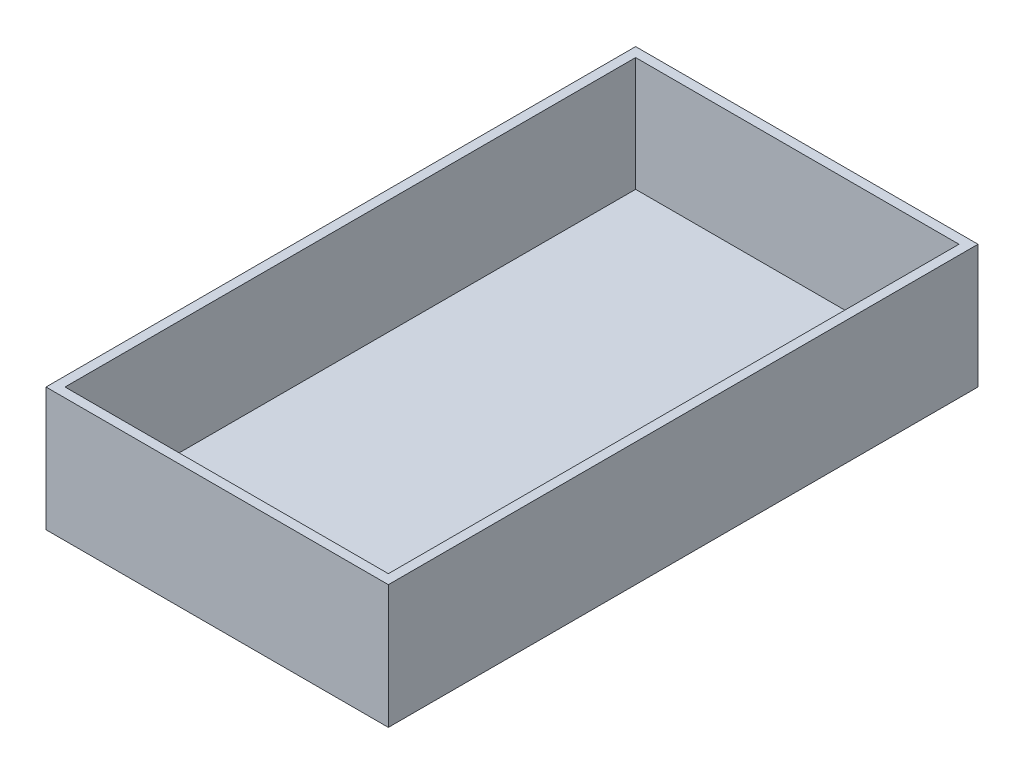
ISO-10303-21;
HEADER;
FILE_DESCRIPTION(('STEP AP214'),'2;1');
FILE_NAME('part.step','',(''),(''),'','','');
FILE_SCHEMA(('AUTOMOTIVE_DESIGN { 1 0 10303 214 1 1 1 1 }'));
ENDSEC;
DATA;
#1=APPLICATION_CONTEXT('core data for automotive mechanical design processes');
#2=APPLICATION_PROTOCOL_DEFINITION('international standard','automotive_design',2000,#1);
#3=PRODUCT_CONTEXT('',#1,'mechanical');
#4=PRODUCT('Part','Part','',(#3));
#5=PRODUCT_RELATED_PRODUCT_CATEGORY('part','',(#4));
#6=PRODUCT_DEFINITION_FORMATION('','',#4);
#7=PRODUCT_DEFINITION_CONTEXT('part definition',#1,'design');
#8=PRODUCT_DEFINITION('design','',#6,#7);
#9=PRODUCT_DEFINITION_SHAPE('','',#8);
#10=(LENGTH_UNIT() NAMED_UNIT(*) SI_UNIT(.MILLI.,.METRE.));
#11=(NAMED_UNIT(*) PLANE_ANGLE_UNIT() SI_UNIT($,.RADIAN.));
#12=(NAMED_UNIT(*) SI_UNIT($,.STERADIAN.) SOLID_ANGLE_UNIT());
#13=UNCERTAINTY_MEASURE_WITH_UNIT(LENGTH_MEASURE(1.E-05),#10,'distance_accuracy_value','');
#14=(GEOMETRIC_REPRESENTATION_CONTEXT(3) GLOBAL_UNCERTAINTY_ASSIGNED_CONTEXT((#13)) GLOBAL_UNIT_ASSIGNED_CONTEXT((#10,
#11,#12)) REPRESENTATION_CONTEXT('',''));
#15=CARTESIAN_POINT('',(0.,0.,0.));
#16=DIRECTION('',(0.,0.,1.));
#17=DIRECTION('',(1.,0.,0.));
#18=AXIS2_PLACEMENT_3D('',#15,#16,#17);
#19=CARTESIAN_POINT('',(-9000.,6000.,-15000.));
#20=DIRECTION('',(1.,0.,0.));
#21=DIRECTION('',(0.,0.,-1.));
#22=AXIS2_PLACEMENT_3D('',#19,#20,#21);
#23=PLANE('',#22);
#24=DIRECTION('',(0.,-1.,0.));
#25=VECTOR('',#24,1.);
#26=CARTESIAN_POINT('',(-9000.,6000.,-15500.));
#27=LINE('',#26,#25);
#28=CARTESIAN_POINT('',(-9000.,6000.,-15500.));
#29=VERTEX_POINT('',#28);
#30=CARTESIAN_POINT('',(-9000.,-500.,-15500.));
#31=VERTEX_POINT('',#30);
#32=EDGE_CURVE('E190',#29,#31,#27,.T.);
#33=ORIENTED_EDGE('',*,*,#32,.T.);
#34=DIRECTION('',(0.,0.,1.));
#35=VECTOR('',#34,1.);
#36=CARTESIAN_POINT('',(-9000.,-500.,-33506.9431053691));
#37=LINE('',#36,#35);
#38=CARTESIAN_POINT('',(-9000.,-500.,15500.));
#39=VERTEX_POINT('',#38);
#40=EDGE_CURVE('E199',#31,#39,#37,.T.);
#41=ORIENTED_EDGE('',*,*,#40,.T.);
#42=DIRECTION('',(0.,-1.,0.));
#43=VECTOR('',#42,1.);
#44=CARTESIAN_POINT('',(-9000.,6000.,15500.));
#45=LINE('',#44,#43);
#46=CARTESIAN_POINT('',(-9000.,6000.,15500.));
#47=VERTEX_POINT('',#46);
#48=EDGE_CURVE('E229',#47,#39,#45,.T.);
#49=ORIENTED_EDGE('',*,*,#48,.F.);
#50=DIRECTION('',(0.,0.,1.));
#51=VECTOR('',#50,1.);
#52=CARTESIAN_POINT('',(-9000.,6000.,-15000.));
#53=LINE('',#52,#51);
#54=EDGE_CURVE('E212',#29,#47,#53,.T.);
#55=ORIENTED_EDGE('',*,*,#54,.F.);
#56=EDGE_LOOP('',(#33,#41,#49,#55));
#57=FACE_BOUND('',#56,.T.);
#58=ADVANCED_FACE('F110',(#57),#23,.F.);
#59=CARTESIAN_POINT('',(-8500.,6000.,-15000.));
#60=DIRECTION('',(1.,0.,0.));
#61=DIRECTION('',(0.,0.,-1.));
#62=AXIS2_PLACEMENT_3D('',#59,#60,#61);
#63=PLANE('',#62);
#64=DIRECTION('',(0.,0.,1.));
#65=VECTOR('',#64,1.);
#66=CARTESIAN_POINT('',(-8500.,0.,-15000.));
#67=LINE('',#66,#65);
#68=CARTESIAN_POINT('',(-8500.,0.,-15000.));
#69=VERTEX_POINT('',#68);
#70=CARTESIAN_POINT('',(-8500.,0.,15000.));
#71=VERTEX_POINT('',#70);
#72=EDGE_CURVE('E213',#69,#71,#67,.T.);
#73=ORIENTED_EDGE('',*,*,#72,.F.);
#74=DIRECTION('',(0.,-1.,0.));
#75=VECTOR('',#74,1.);
#76=CARTESIAN_POINT('',(-8500.,6000.,-15000.));
#77=LINE('',#76,#75);
#78=CARTESIAN_POINT('',(-8500.,6000.,-15000.));
#79=VERTEX_POINT('',#78);
#80=EDGE_CURVE('E120',#79,#69,#77,.T.);
#81=ORIENTED_EDGE('',*,*,#80,.F.);
#82=DIRECTION('',(0.,0.,1.));
#83=VECTOR('',#82,1.);
#84=CARTESIAN_POINT('',(-8500.,6000.,-15000.));
#85=LINE('',#84,#83);
#86=CARTESIAN_POINT('',(-8500.,6000.,15000.));
#87=VERTEX_POINT('',#86);
#88=EDGE_CURVE('E209',#79,#87,#85,.T.);
#89=ORIENTED_EDGE('',*,*,#88,.T.);
#90=DIRECTION('',(0.,-1.,0.));
#91=VECTOR('',#90,1.);
#92=CARTESIAN_POINT('',(-8500.,6000.,15000.));
#93=LINE('',#92,#91);
#94=EDGE_CURVE('E12',#87,#71,#93,.T.);
#95=ORIENTED_EDGE('',*,*,#94,.T.);
#96=EDGE_LOOP('',(#73,#81,#89,#95));
#97=FACE_BOUND('',#96,.T.);
#98=ADVANCED_FACE('F261',(#97),#63,.T.);
#99=CARTESIAN_POINT('',(0.,6000.,0.));
#100=DIRECTION('',(0.,-1.,0.));
#101=DIRECTION('',(0.,0.,-1.));
#102=AXIS2_PLACEMENT_3D('',#99,#100,#101);
#103=PLANE('',#102);
#104=DIRECTION('',(0.,0.,1.));
#105=VECTOR('',#104,1.);
#106=CARTESIAN_POINT('',(9000.,6000.,15000.));
#107=LINE('',#106,#105);
#108=CARTESIAN_POINT('',(9000.,6000.,-15500.));
#109=VERTEX_POINT('',#108);
#110=CARTESIAN_POINT('',(9000.,6000.,15500.));
#111=VERTEX_POINT('',#110);
#112=EDGE_CURVE('E157',#109,#111,#107,.T.);
#113=ORIENTED_EDGE('',*,*,#112,.F.);
#114=DIRECTION('',(1.,0.,0.));
#115=VECTOR('',#114,1.);
#116=CARTESIAN_POINT('',(-9000.,6000.,-15500.));
#117=LINE('',#116,#115);
#118=EDGE_CURVE('E188',#29,#109,#117,.T.);
#119=ORIENTED_EDGE('',*,*,#118,.F.);
#120=ORIENTED_EDGE('',*,*,#54,.T.);
#121=DIRECTION('',(1.,0.,0.));
#122=VECTOR('',#121,1.);
#123=CARTESIAN_POINT('',(-9000.,6000.,15500.));
#124=LINE('',#123,#122);
#125=EDGE_CURVE('E219',#47,#111,#124,.T.);
#126=ORIENTED_EDGE('',*,*,#125,.T.);
#127=EDGE_LOOP('',(#113,#119,#120,#126));
#128=FACE_BOUND('',#127,.T.);
#129=ORIENTED_EDGE('',*,*,#88,.F.);
#130=DIRECTION('',(1.,0.,0.));
#131=VECTOR('',#130,1.);
#132=CARTESIAN_POINT('',(-9000.,6000.,-15000.));
#133=LINE('',#132,#131);
#134=CARTESIAN_POINT('',(8500.,6000.,-15000.));
#135=VERTEX_POINT('',#134);
#136=EDGE_CURVE('E237',#79,#135,#133,.T.);
#137=ORIENTED_EDGE('',*,*,#136,.T.);
#138=DIRECTION('',(0.,0.,1.));
#139=VECTOR('',#138,1.);
#140=CARTESIAN_POINT('',(8500.,6000.,-15000.));
#141=LINE('',#140,#139);
#142=CARTESIAN_POINT('',(8500.,6000.,15000.));
#143=VERTEX_POINT('',#142);
#144=EDGE_CURVE('E231',#135,#143,#141,.T.);
#145=ORIENTED_EDGE('',*,*,#144,.T.);
#146=DIRECTION('',(1.,0.,0.));
#147=VECTOR('',#146,1.);
#148=CARTESIAN_POINT('',(-9000.,6000.,15000.));
#149=LINE('',#148,#147);
#150=EDGE_CURVE('E223',#87,#143,#149,.T.);
#151=ORIENTED_EDGE('',*,*,#150,.F.);
#152=EDGE_LOOP('',(#129,#137,#145,#151));
#153=FACE_BOUND('',#152,.T.);
#154=ADVANCED_FACE('F242',(#128,#153),#103,.F.);
#155=CARTESIAN_POINT('',(8500.,6000.,-15000.));
#156=DIRECTION('',(1.,0.,0.));
#157=DIRECTION('',(0.,0.,-1.));
#158=AXIS2_PLACEMENT_3D('',#155,#156,#157);
#159=PLANE('',#158);
#160=DIRECTION('',(0.,0.,1.));
#161=VECTOR('',#160,1.);
#162=CARTESIAN_POINT('',(8500.,0.,-15000.));
#163=LINE('',#162,#161);
#164=CARTESIAN_POINT('',(8500.,0.,-15000.));
#165=VERTEX_POINT('',#164);
#166=CARTESIAN_POINT('',(8500.,0.,15000.));
#167=VERTEX_POINT('',#166);
#168=EDGE_CURVE('E166',#165,#167,#163,.T.);
#169=ORIENTED_EDGE('',*,*,#168,.T.);
#170=DIRECTION('',(0.,-1.,0.));
#171=VECTOR('',#170,1.);
#172=CARTESIAN_POINT('',(8500.,6000.,15000.));
#173=LINE('',#172,#171);
#174=EDGE_CURVE('E216',#143,#167,#173,.T.);
#175=ORIENTED_EDGE('',*,*,#174,.F.);
#176=ORIENTED_EDGE('',*,*,#144,.F.);
#177=DIRECTION('',(0.,-1.,0.));
#178=VECTOR('',#177,1.);
#179=CARTESIAN_POINT('',(8500.,6000.,-15000.));
#180=LINE('',#179,#178);
#181=EDGE_CURVE('E227',#135,#165,#180,.T.);
#182=ORIENTED_EDGE('',*,*,#181,.T.);
#183=EDGE_LOOP('',(#169,#175,#176,#182));
#184=FACE_BOUND('',#183,.T.);
#185=ADVANCED_FACE('F248',(#184),#159,.F.);
#186=CARTESIAN_POINT('',(-9000.,6000.,15500.));
#187=DIRECTION('',(0.,0.,-1.));
#188=DIRECTION('',(-1.,0.,0.));
#189=AXIS2_PLACEMENT_3D('',#186,#187,#188);
#190=PLANE('',#189);
#191=ORIENTED_EDGE('',*,*,#48,.T.);
#192=DIRECTION('',(1.,0.,0.));
#193=VECTOR('',#192,1.);
#194=CARTESIAN_POINT('',(-9000.,-500.,15500.));
#195=LINE('',#194,#193);
#196=CARTESIAN_POINT('',(9000.,-500.,15500.));
#197=VERTEX_POINT('',#196);
#198=EDGE_CURVE('E203',#39,#197,#195,.T.);
#199=ORIENTED_EDGE('',*,*,#198,.T.);
#200=DIRECTION('',(0.,-1.,0.));
#201=VECTOR('',#200,1.);
#202=CARTESIAN_POINT('',(9000.,6000.,15500.));
#203=LINE('',#202,#201);
#204=EDGE_CURVE('E195',#111,#197,#203,.T.);
#205=ORIENTED_EDGE('',*,*,#204,.F.);
#206=ORIENTED_EDGE('',*,*,#125,.F.);
#207=EDGE_LOOP('',(#191,#199,#205,#206));
#208=FACE_BOUND('',#207,.T.);
#209=ADVANCED_FACE('F246',(#208),#190,.F.);
#210=CARTESIAN_POINT('',(9000.,6000.,15000.));
#211=DIRECTION('',(1.,0.,0.));
#212=DIRECTION('',(0.,0.,-1.));
#213=AXIS2_PLACEMENT_3D('',#210,#211,#212);
#214=PLANE('',#213);
#215=ORIENTED_EDGE('',*,*,#204,.T.);
#216=DIRECTION('',(0.,0.,1.));
#217=VECTOR('',#216,1.);
#218=CARTESIAN_POINT('',(9000.,-500.,-33506.9431053691));
#219=LINE('',#218,#217);
#220=CARTESIAN_POINT('',(9000.,-500.,-15500.));
#221=VERTEX_POINT('',#220);
#222=EDGE_CURVE('E192',#221,#197,#219,.T.);
#223=ORIENTED_EDGE('',*,*,#222,.F.);
#224=DIRECTION('',(0.,-1.,0.));
#225=VECTOR('',#224,1.);
#226=CARTESIAN_POINT('',(9000.,6000.,-15500.));
#227=LINE('',#226,#225);
#228=EDGE_CURVE('E114',#109,#221,#227,.T.);
#229=ORIENTED_EDGE('',*,*,#228,.F.);
#230=ORIENTED_EDGE('',*,*,#112,.T.);
#231=EDGE_LOOP('',(#215,#223,#229,#230));
#232=FACE_BOUND('',#231,.T.);
#233=ADVANCED_FACE('F193',(#232),#214,.T.);
#234=CARTESIAN_POINT('',(-9000.,6000.,-15000.));
#235=DIRECTION('',(0.,0.,-1.));
#236=DIRECTION('',(-1.,0.,0.));
#237=AXIS2_PLACEMENT_3D('',#234,#235,#236);
#238=PLANE('',#237);
#239=ORIENTED_EDGE('',*,*,#80,.T.);
#240=DIRECTION('',(1.,0.,0.));
#241=VECTOR('',#240,1.);
#242=CARTESIAN_POINT('',(-9000.,0.,-15000.));
#243=LINE('',#242,#241);
#244=EDGE_CURVE('E208',#69,#165,#243,.T.);
#245=ORIENTED_EDGE('',*,*,#244,.T.);
#246=ORIENTED_EDGE('',*,*,#181,.F.);
#247=ORIENTED_EDGE('',*,*,#136,.F.);
#248=EDGE_LOOP('',(#239,#245,#246,#247));
#249=FACE_BOUND('',#248,.T.);
#250=ADVANCED_FACE('F112',(#249),#238,.F.);
#251=CARTESIAN_POINT('',(-9000.,6000.,-15500.));
#252=DIRECTION('',(0.,0.,-1.));
#253=DIRECTION('',(-1.,0.,0.));
#254=AXIS2_PLACEMENT_3D('',#251,#252,#253);
#255=PLANE('',#254);
#256=ORIENTED_EDGE('',*,*,#228,.T.);
#257=DIRECTION('',(1.,0.,0.));
#258=VECTOR('',#257,1.);
#259=CARTESIAN_POINT('',(-9000.,-500.,-15500.));
#260=LINE('',#259,#258);
#261=EDGE_CURVE('E186',#31,#221,#260,.T.);
#262=ORIENTED_EDGE('',*,*,#261,.F.);
#263=ORIENTED_EDGE('',*,*,#32,.F.);
#264=ORIENTED_EDGE('',*,*,#118,.T.);
#265=EDGE_LOOP('',(#256,#262,#263,#264));
#266=FACE_BOUND('',#265,.T.);
#267=ADVANCED_FACE('F183',(#266),#255,.T.);
#268=CARTESIAN_POINT('',(-9000.,6000.,15000.));
#269=DIRECTION('',(0.,0.,-1.));
#270=DIRECTION('',(-1.,0.,0.));
#271=AXIS2_PLACEMENT_3D('',#268,#269,#270);
#272=PLANE('',#271);
#273=DIRECTION('',(1.,0.,0.));
#274=VECTOR('',#273,1.);
#275=CARTESIAN_POINT('',(-9000.,0.,15000.));
#276=LINE('',#275,#274);
#277=EDGE_CURVE('E221',#71,#167,#276,.T.);
#278=ORIENTED_EDGE('',*,*,#277,.F.);
#279=ORIENTED_EDGE('',*,*,#94,.F.);
#280=ORIENTED_EDGE('',*,*,#150,.T.);
#281=ORIENTED_EDGE('',*,*,#174,.T.);
#282=EDGE_LOOP('',(#278,#279,#280,#281));
#283=FACE_BOUND('',#282,.T.);
#284=ADVANCED_FACE('F250',(#283),#272,.T.);
#285=CARTESIAN_POINT('',(-9000.,0.,-33506.9431053691));
#286=DIRECTION('',(0.,1.,0.));
#287=DIRECTION('',(0.,0.,1.));
#288=AXIS2_PLACEMENT_3D('',#285,#286,#287);
#289=PLANE('',#288);
#290=ORIENTED_EDGE('',*,*,#168,.F.);
#291=ORIENTED_EDGE('',*,*,#244,.F.);
#292=ORIENTED_EDGE('',*,*,#72,.T.);
#293=ORIENTED_EDGE('',*,*,#277,.T.);
#294=EDGE_LOOP('',(#290,#291,#292,#293));
#295=FACE_BOUND('',#294,.T.);
#296=ADVANCED_FACE('F258',(#295),#289,.T.);
#297=CARTESIAN_POINT('',(-9000.,-500.,-33506.9431053691));
#298=DIRECTION('',(0.,-1.,0.));
#299=DIRECTION('',(0.,0.,-1.));
#300=AXIS2_PLACEMENT_3D('',#297,#298,#299);
#301=PLANE('',#300);
#302=ORIENTED_EDGE('',*,*,#40,.F.);
#303=ORIENTED_EDGE('',*,*,#261,.T.);
#304=ORIENTED_EDGE('',*,*,#222,.T.);
#305=ORIENTED_EDGE('',*,*,#198,.F.);
#306=EDGE_LOOP('',(#302,#303,#304,#305));
#307=FACE_BOUND('',#306,.T.);
#308=ADVANCED_FACE('F201',(#307),#301,.T.);
#309=CLOSED_SHELL('',(#58,#98,#154,#185,#209,#233,#250,#267,#284,#296,#308));
#310=MANIFOLD_SOLID_BREP('B2',#309);
#311=ADVANCED_BREP_SHAPE_REPRESENTATION('',(#18,#310),#14);
#312=SHAPE_DEFINITION_REPRESENTATION(#9,#311);
ENDSEC;
END-ISO-10303-21;
